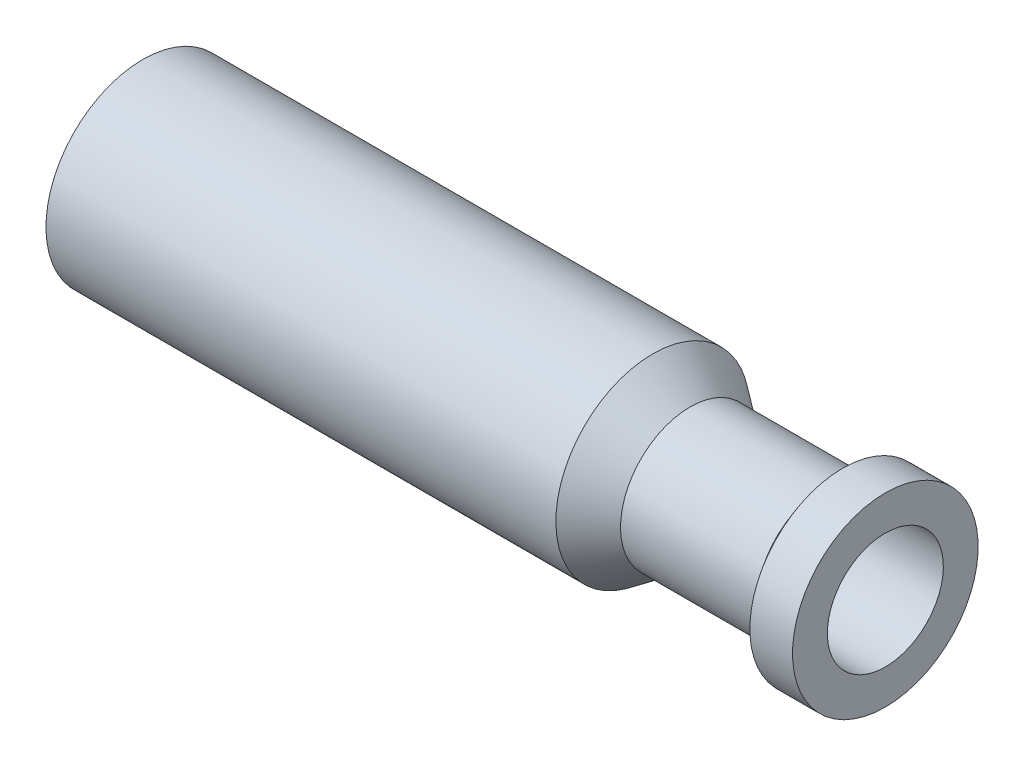
ISO-10303-21;
HEADER;
FILE_DESCRIPTION(('STEP AP214'),'2;1');
FILE_NAME('part.step','',(''),(''),'','','');
FILE_SCHEMA(('AUTOMOTIVE_DESIGN { 1 0 10303 214 1 1 1 1 }'));
ENDSEC;
DATA;
#1=APPLICATION_CONTEXT('core data for automotive mechanical design processes');
#2=APPLICATION_PROTOCOL_DEFINITION('international standard','automotive_design',2000,#1);
#3=PRODUCT_CONTEXT('',#1,'mechanical');
#4=PRODUCT('Part','Part','',(#3));
#5=PRODUCT_RELATED_PRODUCT_CATEGORY('part','',(#4));
#6=PRODUCT_DEFINITION_FORMATION('','',#4);
#7=PRODUCT_DEFINITION_CONTEXT('part definition',#1,'design');
#8=PRODUCT_DEFINITION('design','',#6,#7);
#9=PRODUCT_DEFINITION_SHAPE('','',#8);
#10=(LENGTH_UNIT() NAMED_UNIT(*) SI_UNIT(.MILLI.,.METRE.));
#11=(NAMED_UNIT(*) PLANE_ANGLE_UNIT() SI_UNIT($,.RADIAN.));
#12=(NAMED_UNIT(*) SI_UNIT($,.STERADIAN.) SOLID_ANGLE_UNIT());
#13=UNCERTAINTY_MEASURE_WITH_UNIT(LENGTH_MEASURE(1.E-05),#10,'distance_accuracy_value','');
#14=(GEOMETRIC_REPRESENTATION_CONTEXT(3) GLOBAL_UNCERTAINTY_ASSIGNED_CONTEXT((#13)) GLOBAL_UNIT_ASSIGNED_CONTEXT((#10,
#11,#12)) REPRESENTATION_CONTEXT('',''));
#15=CARTESIAN_POINT('',(0.,0.,0.));
#16=DIRECTION('',(0.,0.,1.));
#17=DIRECTION('',(1.,0.,0.));
#18=AXIS2_PLACEMENT_3D('',#15,#16,#17);
#19=CARTESIAN_POINT('',(171.145497315962,-42.4361493306223,0.));
#20=DIRECTION('',(1.,0.,0.));
#21=DIRECTION('',(0.,1.,0.));
#22=AXIS2_PLACEMENT_3D('',#19,#20,#21);
#23=CYLINDRICAL_SURFACE('',#22,26.5252237368822);
#24=CARTESIAN_POINT('',(-32.0545026840381,-42.4361493306223,0.));
#25=DIRECTION('',(1.,0.,0.));
#26=DIRECTION('',(0.,1.,0.));
#27=AXIS2_PLACEMENT_3D('',#24,#25,#26);
#28=CIRCLE('',#27,26.5252237368822);
#29=CARTESIAN_POINT('',(-32.0545026840381,-15.9109255937401,0.));
#30=VERTEX_POINT('',#29);
#31=EDGE_CURVE('E10',#30,#30,#28,.T.);
#32=ORIENTED_EDGE('',*,*,#31,.T.);
#33=EDGE_LOOP('',(#32));
#34=FACE_BOUND('',#33,.T.);
#35=CARTESIAN_POINT('',(107.503032850586,-42.4361493306223,0.));
#36=DIRECTION('',(1.,0.,0.));
#37=DIRECTION('',(0.,1.,0.));
#38=AXIS2_PLACEMENT_3D('',#35,#36,#37);
#39=CIRCLE('',#38,26.5252237368822);
#40=CARTESIAN_POINT('',(107.503032850586,-15.9109255937401,0.));
#41=VERTEX_POINT('',#40);
#42=EDGE_CURVE('E68',#41,#41,#39,.T.);
#43=ORIENTED_EDGE('',*,*,#42,.F.);
#44=EDGE_LOOP('',(#43));
#45=FACE_BOUND('',#44,.T.);
#46=ADVANCED_FACE('F41',(#34,#45),#23,.T.);
#47=CARTESIAN_POINT('',(-32.0545026840381,-15.9109255937401,0.));
#48=DIRECTION('',(-1.,0.,0.));
#49=DIRECTION('',(0.,-1.,0.));
#50=AXIS2_PLACEMENT_3D('',#47,#48,#49);
#51=PLANE('',#50);
#52=ORIENTED_EDGE('',*,*,#31,.F.);
#53=EDGE_LOOP('',(#52));
#54=FACE_BOUND('',#53,.T.);
#55=ADVANCED_FACE('F93',(#54),#51,.T.);
#56=CARTESIAN_POINT('',(171.145497315962,-17.0361493306223,0.));
#57=DIRECTION('',(1.,0.,0.));
#58=DIRECTION('',(0.,1.,0.));
#59=AXIS2_PLACEMENT_3D('',#56,#57,#58);
#60=PLANE('',#59);
#61=CARTESIAN_POINT('',(171.145497315962,-42.4361493306223,0.));
#62=DIRECTION('',(1.,0.,0.));
#63=DIRECTION('',(0.,1.,0.));
#64=AXIS2_PLACEMENT_3D('',#61,#62,#63);
#65=CIRCLE('',#64,15.875);
#66=CARTESIAN_POINT('',(171.145497315962,-26.5611493306223,0.));
#67=VERTEX_POINT('',#66);
#68=EDGE_CURVE('E73',#67,#67,#65,.T.);
#69=ORIENTED_EDGE('',*,*,#68,.F.);
#70=EDGE_LOOP('',(#69));
#71=FACE_BOUND('',#70,.T.);
#72=CARTESIAN_POINT('',(171.145497315962,-42.4361493306223,0.));
#73=DIRECTION('',(1.,0.,0.));
#74=DIRECTION('',(0.,1.,0.));
#75=AXIS2_PLACEMENT_3D('',#72,#73,#74);
#76=CIRCLE('',#75,25.4);
#77=CARTESIAN_POINT('',(171.145497315962,-17.0361493306223,0.));
#78=VERTEX_POINT('',#77);
#79=EDGE_CURVE('E48',#78,#78,#76,.T.);
#80=ORIENTED_EDGE('',*,*,#79,.T.);
#81=EDGE_LOOP('',(#80));
#82=FACE_BOUND('',#81,.T.);
#83=ADVANCED_FACE('F90',(#71,#82),#60,.T.);
#84=CARTESIAN_POINT('',(171.145497315962,-42.4361493306223,0.));
#85=DIRECTION('',(1.,0.,0.));
#86=DIRECTION('',(0.,1.,0.));
#87=AXIS2_PLACEMENT_3D('',#84,#85,#86);
#88=CYLINDRICAL_SURFACE('',#87,25.4);
#89=CARTESIAN_POINT('',(159.466804827145,-42.4361493306223,0.));
#90=DIRECTION('',(1.,0.,0.));
#91=DIRECTION('',(0.,1.,0.));
#92=AXIS2_PLACEMENT_3D('',#89,#90,#91);
#93=CIRCLE('',#92,25.4);
#94=CARTESIAN_POINT('',(159.466804827145,-17.0361493306223,0.));
#95=VERTEX_POINT('',#94);
#96=EDGE_CURVE('E53',#95,#95,#93,.T.);
#97=ORIENTED_EDGE('',*,*,#96,.T.);
#98=EDGE_LOOP('',(#97));
#99=FACE_BOUND('',#98,.T.);
#100=ORIENTED_EDGE('',*,*,#79,.F.);
#101=EDGE_LOOP('',(#100));
#102=FACE_BOUND('',#101,.T.);
#103=ADVANCED_FACE('F92',(#99,#102),#88,.T.);
#104=CARTESIAN_POINT('',(159.466804827145,-42.4361493306223,0.));
#105=DIRECTION('',(1.,0.,0.));
#106=DIRECTION('',(0.,1.,0.));
#107=AXIS2_PLACEMENT_3D('',#104,#105,#106);
#108=CONICAL_SURFACE('',#107,25.4,0.938921702145989);
#109=CARTESIAN_POINT('',(154.818669260434,-42.4361493306223,0.));
#110=DIRECTION('',(1.,0.,0.));
#111=DIRECTION('',(0.,1.,0.));
#112=AXIS2_PLACEMENT_3D('',#109,#110,#111);
#113=CIRCLE('',#112,19.05);
#114=CARTESIAN_POINT('',(154.818669260434,-23.3861493306223,0.));
#115=VERTEX_POINT('',#114);
#116=EDGE_CURVE('E58',#115,#115,#113,.T.);
#117=ORIENTED_EDGE('',*,*,#116,.T.);
#118=EDGE_LOOP('',(#117));
#119=FACE_BOUND('',#118,.T.);
#120=ORIENTED_EDGE('',*,*,#96,.F.);
#121=EDGE_LOOP('',(#120));
#122=FACE_BOUND('',#121,.T.);
#123=ADVANCED_FACE('F99',(#119,#122),#108,.T.);
#124=CARTESIAN_POINT('',(171.145497315962,-42.4361493306223,0.));
#125=DIRECTION('',(1.,0.,0.));
#126=DIRECTION('',(0.,1.,0.));
#127=AXIS2_PLACEMENT_3D('',#124,#125,#126);
#128=CYLINDRICAL_SURFACE('',#127,19.05);
#129=CARTESIAN_POINT('',(117.715228697274,-42.4361493306223,0.));
#130=DIRECTION('',(1.,0.,0.));
#131=DIRECTION('',(0.,1.,0.));
#132=AXIS2_PLACEMENT_3D('',#129,#130,#131);
#133=CIRCLE('',#132,19.05);
#134=CARTESIAN_POINT('',(117.715228697274,-23.3861493306223,0.));
#135=VERTEX_POINT('',#134);
#136=EDGE_CURVE('E64',#135,#135,#133,.T.);
#137=ORIENTED_EDGE('',*,*,#136,.T.);
#138=EDGE_LOOP('',(#137));
#139=FACE_BOUND('',#138,.T.);
#140=ORIENTED_EDGE('',*,*,#116,.F.);
#141=EDGE_LOOP('',(#140));
#142=FACE_BOUND('',#141,.T.);
#143=ADVANCED_FACE('F111',(#139,#142),#128,.T.);
#144=CARTESIAN_POINT('',(117.715228697274,-42.4361493306223,0.));
#145=DIRECTION('',(-1.,0.,0.));
#146=DIRECTION('',(0.,-1.,0.));
#147=AXIS2_PLACEMENT_3D('',#144,#145,#146);
#148=CONICAL_SURFACE('',#147,19.05,0.631874624648907);
#149=ORIENTED_EDGE('',*,*,#42,.T.);
#150=EDGE_LOOP('',(#149));
#151=FACE_BOUND('',#150,.T.);
#152=ORIENTED_EDGE('',*,*,#136,.F.);
#153=EDGE_LOOP('',(#152));
#154=FACE_BOUND('',#153,.T.);
#155=ADVANCED_FACE('F86',(#151,#154),#148,.T.);
#156=CARTESIAN_POINT('',(-19.3545026840381,-42.4361493306223,0.));
#157=DIRECTION('',(1.,0.,0.));
#158=DIRECTION('',(0.,1.,0.));
#159=AXIS2_PLACEMENT_3D('',#156,#157,#158);
#160=CYLINDRICAL_SURFACE('',#159,15.875);
#161=CARTESIAN_POINT('',(-19.3545026840381,-42.4361493306223,0.));
#162=DIRECTION('',(1.,0.,0.));
#163=DIRECTION('',(0.,1.,0.));
#164=AXIS2_PLACEMENT_3D('',#161,#162,#163);
#165=CIRCLE('',#164,15.875);
#166=CARTESIAN_POINT('',(-19.3545026840381,-26.5611493306223,0.));
#167=VERTEX_POINT('',#166);
#168=EDGE_CURVE('E72',#167,#167,#165,.T.);
#169=ORIENTED_EDGE('',*,*,#168,.F.);
#170=EDGE_LOOP('',(#169));
#171=FACE_BOUND('',#170,.T.);
#172=ORIENTED_EDGE('',*,*,#68,.T.);
#173=EDGE_LOOP('',(#172));
#174=FACE_BOUND('',#173,.T.);
#175=ADVANCED_FACE('F83',(#171,#174),#160,.F.);
#176=CARTESIAN_POINT('',(-19.3545026840381,-42.4361493306223,0.));
#177=DIRECTION('',(1.,0.,0.));
#178=DIRECTION('',(0.,1.,0.));
#179=AXIS2_PLACEMENT_3D('',#176,#177,#178);
#180=PLANE('',#179);
#181=ORIENTED_EDGE('',*,*,#168,.T.);
#182=EDGE_LOOP('',(#181));
#183=FACE_BOUND('',#182,.T.);
#184=ADVANCED_FACE('F81',(#183),#180,.T.);
#185=CLOSED_SHELL('',(#46,#55,#83,#103,#123,#143,#155,#175,#184));
#186=MANIFOLD_SOLID_BREP('B2',#185);
#187=ADVANCED_BREP_SHAPE_REPRESENTATION('',(#18,#186),#14);
#188=SHAPE_DEFINITION_REPRESENTATION(#9,#187);
ENDSEC;
END-ISO-10303-21;
